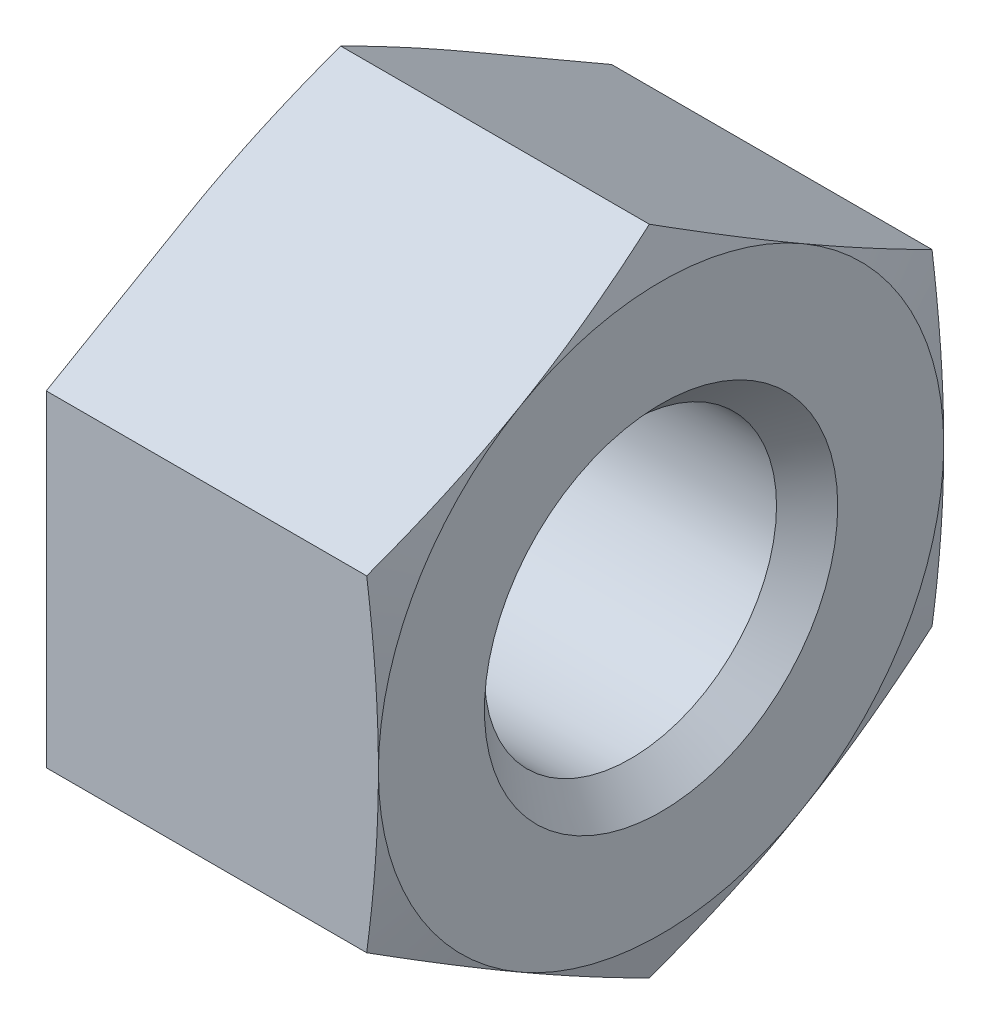
ISO-10303-21;
HEADER;
FILE_DESCRIPTION(('STEP AP214'),'2;1');
FILE_NAME('part.step','',(''),(''),'','','');
FILE_SCHEMA(('AUTOMOTIVE_DESIGN { 1 0 10303 214 1 1 1 1 }'));
ENDSEC;
DATA;
#1=APPLICATION_CONTEXT('core data for automotive mechanical design processes');
#2=APPLICATION_PROTOCOL_DEFINITION('international standard','automotive_design',2000,#1);
#3=PRODUCT_CONTEXT('',#1,'mechanical');
#4=PRODUCT('Part','Part','',(#3));
#5=PRODUCT_RELATED_PRODUCT_CATEGORY('part','',(#4));
#6=PRODUCT_DEFINITION_FORMATION('','',#4);
#7=PRODUCT_DEFINITION_CONTEXT('part definition',#1,'design');
#8=PRODUCT_DEFINITION('design','',#6,#7);
#9=PRODUCT_DEFINITION_SHAPE('','',#8);
#10=(LENGTH_UNIT() NAMED_UNIT(*) SI_UNIT(.MILLI.,.METRE.));
#11=(NAMED_UNIT(*) PLANE_ANGLE_UNIT() SI_UNIT($,.RADIAN.));
#12=(NAMED_UNIT(*) SI_UNIT($,.STERADIAN.) SOLID_ANGLE_UNIT());
#13=UNCERTAINTY_MEASURE_WITH_UNIT(LENGTH_MEASURE(1.E-05),#10,'distance_accuracy_value','');
#14=(GEOMETRIC_REPRESENTATION_CONTEXT(3) GLOBAL_UNCERTAINTY_ASSIGNED_CONTEXT((#13)) GLOBAL_UNIT_ASSIGNED_CONTEXT((#10,
#11,#12)) REPRESENTATION_CONTEXT('',''));
#15=CARTESIAN_POINT('',(0.,0.,0.));
#16=DIRECTION('',(0.,0.,1.));
#17=DIRECTION('',(1.,0.,0.));
#18=AXIS2_PLACEMENT_3D('',#15,#16,#17);
#19=CARTESIAN_POINT('',(4.70000000000001,0.,3.25));
#20=DIRECTION('',(1.,0.,0.));
#21=DIRECTION('',(0.,0.,-1.));
#22=AXIS2_PLACEMENT_3D('',#19,#20,#21);
#23=PLANE('',#22);
#24=CARTESIAN_POINT('',(4.70000000000001,0.,0.));
#25=DIRECTION('',(1.,0.,0.));
#26=DIRECTION('',(0.,0.,-1.));
#27=AXIS2_PLACEMENT_3D('',#24,#25,#26);
#28=CIRCLE('',#27,2.50000000003422);
#29=CARTESIAN_POINT('',(4.70000000000001,0.,-2.50000000003422));
#30=VERTEX_POINT('',#29);
#31=EDGE_CURVE('E13',#30,#30,#28,.F.);
#32=ORIENTED_EDGE('',*,*,#31,.T.);
#33=EDGE_LOOP('',(#32));
#34=FACE_BOUND('',#33,.T.);
#35=CARTESIAN_POINT('',(4.69999999999999,0.,0.));
#36=DIRECTION('',(-1.,0.,0.));
#37=DIRECTION('',(0.,0.,1.));
#38=AXIS2_PLACEMENT_3D('',#35,#36,#37);
#39=CIRCLE('',#38,3.99999999999999);
#40=CARTESIAN_POINT('',(4.69999999999999,3.46410161513776,1.99999999999999));
#41=VERTEX_POINT('',#40);
#42=CARTESIAN_POINT('',(4.69999999999999,3.46410161513776,-1.99999999999999));
#43=VERTEX_POINT('',#42);
#44=EDGE_CURVE('E294',#41,#43,#39,.T.);
#45=ORIENTED_EDGE('',*,*,#44,.F.);
#46=CARTESIAN_POINT('',(4.69999999999999,0.,0.));
#47=DIRECTION('',(-1.,0.,0.));
#48=DIRECTION('',(0.,0.,1.));
#49=AXIS2_PLACEMENT_3D('',#46,#47,#48);
#50=CIRCLE('',#49,3.99999999999999);
#51=CARTESIAN_POINT('',(4.69999999999999,0.,4.));
#52=VERTEX_POINT('',#51);
#53=EDGE_CURVE('E300',#52,#41,#50,.T.);
#54=ORIENTED_EDGE('',*,*,#53,.F.);
#55=CARTESIAN_POINT('',(4.69999999999999,0.,0.));
#56=DIRECTION('',(-1.,0.,0.));
#57=DIRECTION('',(0.,0.,1.));
#58=AXIS2_PLACEMENT_3D('',#55,#56,#57);
#59=CIRCLE('',#58,4.);
#60=CARTESIAN_POINT('',(4.69999999999999,-3.46410161513775,2.));
#61=VERTEX_POINT('',#60);
#62=EDGE_CURVE('E449',#61,#52,#59,.T.);
#63=ORIENTED_EDGE('',*,*,#62,.F.);
#64=CARTESIAN_POINT('',(4.69999999999999,0.,0.));
#65=DIRECTION('',(-1.,0.,0.));
#66=DIRECTION('',(0.,0.,1.));
#67=AXIS2_PLACEMENT_3D('',#64,#65,#66);
#68=CIRCLE('',#67,4.);
#69=CARTESIAN_POINT('',(4.69999999999999,-3.46410161513776,-2.));
#70=VERTEX_POINT('',#69);
#71=EDGE_CURVE('E351',#70,#61,#68,.T.);
#72=ORIENTED_EDGE('',*,*,#71,.F.);
#73=CARTESIAN_POINT('',(4.69999999999999,0.,0.));
#74=DIRECTION('',(-1.,0.,0.));
#75=DIRECTION('',(0.,0.,1.));
#76=AXIS2_PLACEMENT_3D('',#73,#74,#75);
#77=CIRCLE('',#76,3.99999999999999);
#78=CARTESIAN_POINT('',(4.69999999999999,0.,-4.));
#79=VERTEX_POINT('',#78);
#80=EDGE_CURVE('E453',#79,#70,#77,.T.);
#81=ORIENTED_EDGE('',*,*,#80,.F.);
#82=CARTESIAN_POINT('',(4.69999999999999,0.,0.));
#83=DIRECTION('',(-1.,0.,0.));
#84=DIRECTION('',(0.,0.,1.));
#85=AXIS2_PLACEMENT_3D('',#82,#83,#84);
#86=CIRCLE('',#85,3.99999999999999);
#87=EDGE_CURVE('E299',#43,#79,#86,.T.);
#88=ORIENTED_EDGE('',*,*,#87,.F.);
#89=EDGE_LOOP('',(#45,#54,#63,#72,#81,#88));
#90=FACE_BOUND('',#89,.T.);
#91=ADVANCED_FACE('F44',(#34,#90),#23,.T.);
#92=CARTESIAN_POINT('',(4.53319761746661,0.,0.));
#93=DIRECTION('',(-1.,0.,0.));
#94=DIRECTION('',(0.,0.,1.));
#95=AXIS2_PLACEMENT_3D('',#92,#93,#94);
#96=CONICAL_SURFACE('',#95,4.62251496643811,1.30899693899575);
#97=CARTESIAN_POINT('',(4.53419246269047,2.30940107675851,4.));
#98=CARTESIAN_POINT('',(4.55985048781709,2.11795151865036,4.));
#99=CARTESIAN_POINT('',(4.58314922202024,1.92615832316376,4.));
#100=CARTESIAN_POINT('',(4.62406480463608,1.54219210579289,4.));
#101=CARTESIAN_POINT('',(4.6416880879015,1.35001976439242,4.));
#102=CARTESIAN_POINT('',(4.67035550014955,0.965121254191912,4.));
#103=CARTESIAN_POINT('',(4.68139807691226,0.772394965493235,4.));
#104=CARTESIAN_POINT('',(4.69251903254672,0.482994576672206,4.));
#105=CARTESIAN_POINT('',(4.69531890816352,0.386419587345948,4.));
#106=CARTESIAN_POINT('',(4.69906161862543,0.193230639770234,4.));
#107=CARTESIAN_POINT('',(4.70000439372039,0.0966166803669827,4.));
#108=CARTESIAN_POINT('',(4.69999999999999,0.,4.));
#109=B_SPLINE_CURVE_WITH_KNOTS('',3,(#97,#98,#99,#100,#101,#102,#103,#104,#105,#106,#107,#108),
.UNSPECIFIED.,.F.,.F.,(4,2,2,2,2,4),(0.,0.579508867445603,1.15835835267688,1.73734431967293,
2.02717528177891,2.31701556872231),.UNSPECIFIED.);
#110=CARTESIAN_POINT('',(4.53419246269047,2.30940107675851,4.));
#111=VERTEX_POINT('',#110);
#112=EDGE_CURVE('E343',#111,#52,#109,.T.);
#113=ORIENTED_EDGE('',*,*,#112,.T.);
#114=ORIENTED_EDGE('',*,*,#53,.T.);
#115=CARTESIAN_POINT('',(4.69999999999999,3.46410161513776,1.99999999999999));
#116=CARTESIAN_POINT('',(4.70000439372039,3.41579327495427,2.08367249962712));
#117=CARTESIAN_POINT('',(4.69906161862543,3.36748629525264,2.16734264283053));
#118=CARTESIAN_POINT('',(4.69531890816352,3.27089182146479,2.33464917916148));
#119=CARTESIAN_POINT('',(4.69251903254672,3.22260432680166,2.41828557328823));
#120=CARTESIAN_POINT('',(4.68139807691226,3.07790413239114,2.66891366187234));
#121=CARTESIAN_POINT('',(4.67035550014955,2.98154098804181,2.83581952386249));
#122=CARTESIAN_POINT('',(4.6416880879015,2.78909173294155,3.16915141157491));
#123=CARTESIAN_POINT('',(4.62406480463608,2.69300556224132,3.33557754113246));
#124=CARTESIAN_POINT('',(4.58314922202024,2.50102245355589,3.66810203957064));
#125=CARTESIAN_POINT('',(4.55985048781709,2.40512585581259,3.83419981913503));
#126=CARTESIAN_POINT('',(4.53419246269047,2.30940107675851,4.));
#127=B_SPLINE_CURVE_WITH_KNOTS('',3,(#115,#116,#117,#118,#119,#120,#121,#122,#123,#124,#125,
#126),.UNSPECIFIED.,.F.,.F.,(4,2,2,2,2,4),(0.,0.2898402869434,0.579671249049377,
1.15865721604543,1.7375067012767,2.31701556872231),.UNSPECIFIED.);
#128=EDGE_CURVE('E270',#41,#111,#127,.T.);
#129=ORIENTED_EDGE('',*,*,#128,.T.);
#130=EDGE_LOOP('',(#113,#114,#129));
#131=FACE_BOUND('',#130,.T.);
#132=ADVANCED_FACE('F255',(#131),#96,.T.);
#133=CARTESIAN_POINT('',(4.53319761746661,0.,0.));
#134=DIRECTION('',(-1.,0.,0.));
#135=DIRECTION('',(0.,0.,1.));
#136=AXIS2_PLACEMENT_3D('',#133,#134,#135);
#137=CONICAL_SURFACE('',#136,4.6225149664381,1.30899693899575);
#138=CARTESIAN_POINT('',(4.53419246269047,4.618802153517,0.));
#139=CARTESIAN_POINT('',(4.5598504878171,4.52307737446293,0.165800180864965));
#140=CARTESIAN_POINT('',(4.58314922202024,4.42718077671963,0.331897960429355));
#141=CARTESIAN_POINT('',(4.62406480463608,4.2351976680342,0.664422458867538));
#142=CARTESIAN_POINT('',(4.6416880879015,4.13911149733396,0.830848588425083));
#143=CARTESIAN_POINT('',(4.67035550014955,3.94666224223371,1.1641804761375));
#144=CARTESIAN_POINT('',(4.68139807691226,3.85029909788437,1.33108633812765));
#145=CARTESIAN_POINT('',(4.69251903254672,3.70559890347386,1.58171442671175));
#146=CARTESIAN_POINT('',(4.69531890816352,3.65731140881073,1.6653508208385));
#147=CARTESIAN_POINT('',(4.69906161862543,3.56071693502288,1.83265735716945));
#148=CARTESIAN_POINT('',(4.70000439372039,3.51240995532125,1.91632750037286));
#149=CARTESIAN_POINT('',(4.69999999999999,3.46410161513776,1.99999999999999));
#150=B_SPLINE_CURVE_WITH_KNOTS('',3,(#138,#139,#140,#141,#142,#143,#144,#145,#146,#147,#148,
#149),.UNSPECIFIED.,.F.,.F.,(4,2,2,2,2,4),(0.,0.579508867445597,1.15835835267687,
1.73734431967291,2.02717528177889,2.31701556872228),.UNSPECIFIED.);
#151=CARTESIAN_POINT('',(4.53419246269047,4.618802153517,0.));
#152=VERTEX_POINT('',#151);
#153=EDGE_CURVE('E262',#152,#41,#150,.T.);
#154=ORIENTED_EDGE('',*,*,#153,.T.);
#155=ORIENTED_EDGE('',*,*,#44,.T.);
#156=CARTESIAN_POINT('',(4.69999999999999,3.46410161513776,-1.99999999999999));
#157=CARTESIAN_POINT('',(4.70000439372039,3.51240995532125,-1.91632750037286));
#158=CARTESIAN_POINT('',(4.69906161862543,3.56071693502288,-1.83265735716945));
#159=CARTESIAN_POINT('',(4.69531890816352,3.65731140881073,-1.6653508208385));
#160=CARTESIAN_POINT('',(4.69251903254672,3.70559890347386,-1.58171442671175));
#161=CARTESIAN_POINT('',(4.68139807691226,3.85029909788437,-1.33108633812765));
#162=CARTESIAN_POINT('',(4.67035550014955,3.94666224223371,-1.1641804761375));
#163=CARTESIAN_POINT('',(4.6416880879015,4.13911149733396,-0.830848588425084));
#164=CARTESIAN_POINT('',(4.62406480463608,4.2351976680342,-0.664422458867538));
#165=CARTESIAN_POINT('',(4.58314922202024,4.42718077671962,-0.331897960429356));
#166=CARTESIAN_POINT('',(4.5598504878171,4.52307737446292,-0.165800180864965));
#167=CARTESIAN_POINT('',(4.53419246269047,4.618802153517,0.));
#168=B_SPLINE_CURVE_WITH_KNOTS('',3,(#156,#157,#158,#159,#160,#161,#162,#163,#164,#165,#166,
#167),.UNSPECIFIED.,.F.,.F.,(4,2,2,2,2,4),(0.,0.289840286943397,0.57967124904937,
1.15865721604542,1.73750670127669,2.31701556872228),.UNSPECIFIED.);
#169=EDGE_CURVE('E233',#43,#152,#168,.T.);
#170=ORIENTED_EDGE('',*,*,#169,.T.);
#171=EDGE_LOOP('',(#154,#155,#170));
#172=FACE_BOUND('',#171,.T.);
#173=ADVANCED_FACE('F250',(#172),#137,.T.);
#174=CARTESIAN_POINT('',(4.53319761746661,0.,0.));
#175=DIRECTION('',(-1.,0.,0.));
#176=DIRECTION('',(0.,0.,1.));
#177=AXIS2_PLACEMENT_3D('',#174,#175,#176);
#178=CONICAL_SURFACE('',#177,4.62251496643811,1.30899693899575);
#179=ORIENTED_EDGE('',*,*,#87,.T.);
#180=CARTESIAN_POINT('',(4.69999999999999,0.,-4.));
#181=CARTESIAN_POINT('',(4.70000439372039,0.0966166803669833,-4.));
#182=CARTESIAN_POINT('',(4.69906161862543,0.193230639770234,-4.));
#183=CARTESIAN_POINT('',(4.69531890816352,0.386419587345948,-4.));
#184=CARTESIAN_POINT('',(4.69251903254672,0.482994576672206,-4.));
#185=CARTESIAN_POINT('',(4.68139807691226,0.772394965493235,-4.));
#186=CARTESIAN_POINT('',(4.67035550014955,0.965121254191912,-4.));
#187=CARTESIAN_POINT('',(4.6416880879015,1.35001976439242,-4.));
#188=CARTESIAN_POINT('',(4.62406480463608,1.54219210579289,-4.));
#189=CARTESIAN_POINT('',(4.58314922202024,1.92615832316376,-4.));
#190=CARTESIAN_POINT('',(4.55985048781709,2.11795151865036,-4.));
#191=CARTESIAN_POINT('',(4.53419246269047,2.30940107675851,-4.));
#192=B_SPLINE_CURVE_WITH_KNOTS('',3,(#180,#181,#182,#183,#184,#185,#186,#187,#188,#189,#190,
#191),.UNSPECIFIED.,.F.,.F.,(4,2,2,2,2,4),(0.,0.2898402869434,0.579671249049376,
1.15865721604543,1.7375067012767,2.31701556872231),.UNSPECIFIED.);
#193=CARTESIAN_POINT('',(4.53419246269047,2.30940107675851,-4.));
#194=VERTEX_POINT('',#193);
#195=EDGE_CURVE('E423',#79,#194,#192,.T.);
#196=ORIENTED_EDGE('',*,*,#195,.T.);
#197=CARTESIAN_POINT('',(4.53419246269047,2.30940107675851,-4.));
#198=CARTESIAN_POINT('',(4.55985048781709,2.40512585581259,-3.83419981913503));
#199=CARTESIAN_POINT('',(4.58314922202024,2.50102245355589,-3.66810203957064));
#200=CARTESIAN_POINT('',(4.62406480463608,2.69300556224132,-3.33557754113246));
#201=CARTESIAN_POINT('',(4.6416880879015,2.78909173294155,-3.16915141157491));
#202=CARTESIAN_POINT('',(4.67035550014955,2.98154098804181,-2.83581952386249));
#203=CARTESIAN_POINT('',(4.68139807691226,3.07790413239114,-2.66891366187234));
#204=CARTESIAN_POINT('',(4.69251903254672,3.22260432680166,-2.41828557328823));
#205=CARTESIAN_POINT('',(4.69531890816352,3.27089182146479,-2.33464917916148));
#206=CARTESIAN_POINT('',(4.69906161862543,3.36748629525264,-2.16734264283053));
#207=CARTESIAN_POINT('',(4.70000439372039,3.41579327495427,-2.08367249962712));
#208=CARTESIAN_POINT('',(4.69999999999999,3.46410161513776,-1.99999999999999));
#209=B_SPLINE_CURVE_WITH_KNOTS('',3,(#197,#198,#199,#200,#201,#202,#203,#204,#205,#206,#207,
#208),.UNSPECIFIED.,.F.,.F.,(4,2,2,2,2,4),(0.,0.579508867445603,1.15835835267688,
1.73734431967293,2.02717528177891,2.31701556872231),.UNSPECIFIED.);
#210=EDGE_CURVE('E225',#194,#43,#209,.T.);
#211=ORIENTED_EDGE('',*,*,#210,.T.);
#212=EDGE_LOOP('',(#179,#196,#211));
#213=FACE_BOUND('',#212,.T.);
#214=ADVANCED_FACE('F254',(#213),#178,.T.);
#215=CARTESIAN_POINT('',(4.53319761746661,0.,0.));
#216=DIRECTION('',(-1.,0.,0.));
#217=DIRECTION('',(0.,0.,1.));
#218=AXIS2_PLACEMENT_3D('',#215,#216,#217);
#219=CONICAL_SURFACE('',#218,4.62251496643811,1.30899693899575);
#220=ORIENTED_EDGE('',*,*,#80,.T.);
#221=CARTESIAN_POINT('',(4.69999999999998,-3.46410161513776,-2.));
#222=CARTESIAN_POINT('',(4.70000439372039,-3.41579327495427,-2.08367249962713));
#223=CARTESIAN_POINT('',(4.69906161862543,-3.36748629525265,-2.16734264283054));
#224=CARTESIAN_POINT('',(4.69531890816352,-3.27089182146479,-2.33464917916149));
#225=CARTESIAN_POINT('',(4.69251903254672,-3.22260432680166,-2.41828557328824));
#226=CARTESIAN_POINT('',(4.68139807691226,-3.07790413239115,-2.66891366187235));
#227=CARTESIAN_POINT('',(4.67035550014955,-2.98154098804181,-2.83581952386249));
#228=CARTESIAN_POINT('',(4.6416880879015,-2.78909173294156,-3.16915141157491));
#229=CARTESIAN_POINT('',(4.62406480463607,-2.69300556224132,-3.33557754113246));
#230=CARTESIAN_POINT('',(4.58314922202024,-2.50102245355589,-3.66810203957064));
#231=CARTESIAN_POINT('',(4.55985048781709,-2.40512585581259,-3.83419981913504));
#232=CARTESIAN_POINT('',(4.53419246269047,-2.30940107675851,-4.));
#233=B_SPLINE_CURVE_WITH_KNOTS('',3,(#221,#222,#223,#224,#225,#226,#227,#228,#229,#230,#231,
#232),.UNSPECIFIED.,.F.,.F.,(4,2,2,2,2,4),(0.,0.289840286943399,0.579671249049374,
1.15865721604542,1.7375067012767,2.3170155687223),.UNSPECIFIED.);
#234=CARTESIAN_POINT('',(4.53419246269047,-2.30940107675851,-4.));
#235=VERTEX_POINT('',#234);
#236=EDGE_CURVE('E369',#70,#235,#233,.T.);
#237=ORIENTED_EDGE('',*,*,#236,.T.);
#238=CARTESIAN_POINT('',(4.53419246269047,-2.30940107675851,-4.));
#239=CARTESIAN_POINT('',(4.55985048781709,-2.11795151865036,-4.));
#240=CARTESIAN_POINT('',(4.58314922202024,-1.92615832316375,-4.));
#241=CARTESIAN_POINT('',(4.62406480463608,-1.54219210579289,-4.));
#242=CARTESIAN_POINT('',(4.6416880879015,-1.35001976439242,-4.));
#243=CARTESIAN_POINT('',(4.67035550014955,-0.965121254191912,-4.));
#244=CARTESIAN_POINT('',(4.68139807691226,-0.772394965493235,-4.));
#245=CARTESIAN_POINT('',(4.69251903254672,-0.482994576672206,-4.));
#246=CARTESIAN_POINT('',(4.69531890816352,-0.386419587345949,-4.));
#247=CARTESIAN_POINT('',(4.69906161862543,-0.193230639770234,-4.));
#248=CARTESIAN_POINT('',(4.70000439372039,-0.0966166803669837,-4.));
#249=CARTESIAN_POINT('',(4.69999999999999,0.,-4.));
#250=B_SPLINE_CURVE_WITH_KNOTS('',3,(#238,#239,#240,#241,#242,#243,#244,#245,#246,#247,#248,
#249),.UNSPECIFIED.,.F.,.F.,(4,2,2,2,2,4),(0.,0.579508867445602,1.15835835267688,
1.73734431967293,2.02717528177891,2.31701556872231),.UNSPECIFIED.);
#251=EDGE_CURVE('E242',#235,#79,#250,.T.);
#252=ORIENTED_EDGE('',*,*,#251,.T.);
#253=EDGE_LOOP('',(#220,#237,#252));
#254=FACE_BOUND('',#253,.T.);
#255=ADVANCED_FACE('F379',(#254),#219,.T.);
#256=CARTESIAN_POINT('',(4.53319761746661,0.,0.));
#257=DIRECTION('',(-1.,0.,0.));
#258=DIRECTION('',(0.,0.,1.));
#259=AXIS2_PLACEMENT_3D('',#256,#257,#258);
#260=CONICAL_SURFACE('',#259,4.62251496643811,1.30899693899575);
#261=CARTESIAN_POINT('',(4.53419246269047,-2.30940107675851,3.99999999999999));
#262=CARTESIAN_POINT('',(4.55985048781709,-2.40512585581258,3.83419981913503));
#263=CARTESIAN_POINT('',(4.58314922202024,-2.50102245355588,3.66810203957064));
#264=CARTESIAN_POINT('',(4.62406480463608,-2.69300556224131,3.33557754113246));
#265=CARTESIAN_POINT('',(4.6416880879015,-2.78909173294155,3.16915141157491));
#266=CARTESIAN_POINT('',(4.67035550014955,-2.9815409880418,2.83581952386249));
#267=CARTESIAN_POINT('',(4.68139807691226,-3.07790413239114,2.66891366187234));
#268=CARTESIAN_POINT('',(4.69251903254672,-3.22260432680165,2.41828557328824));
#269=CARTESIAN_POINT('',(4.69531890816352,-3.27089182146478,2.33464917916149));
#270=CARTESIAN_POINT('',(4.69906161862543,-3.36748629525264,2.16734264283054));
#271=CARTESIAN_POINT('',(4.70000439372039,-3.41579327495427,2.08367249962713));
#272=CARTESIAN_POINT('',(4.69999999999999,-3.46410161513776,2.));
#273=B_SPLINE_CURVE_WITH_KNOTS('',3,(#261,#262,#263,#264,#265,#266,#267,#268,#269,#270,#271,
#272),.UNSPECIFIED.,.F.,.F.,(4,2,2,2,2,4),(0.,0.579508867445601,1.15835835267688,
1.73734431967292,2.0271752817789,2.3170155687223),.UNSPECIFIED.);
#274=CARTESIAN_POINT('',(4.53419246269047,-2.3094010767585,4.));
#275=VERTEX_POINT('',#274);
#276=EDGE_CURVE('E321',#275,#61,#273,.T.);
#277=ORIENTED_EDGE('',*,*,#276,.T.);
#278=ORIENTED_EDGE('',*,*,#62,.T.);
#279=CARTESIAN_POINT('',(4.69999999999999,0.,4.));
#280=CARTESIAN_POINT('',(4.70000439372039,-0.0966166803669837,4.));
#281=CARTESIAN_POINT('',(4.69906161862543,-0.193230639770234,4.));
#282=CARTESIAN_POINT('',(4.69531890816352,-0.386419587345948,4.));
#283=CARTESIAN_POINT('',(4.69251903254672,-0.482994576672206,4.));
#284=CARTESIAN_POINT('',(4.68139807691226,-0.772394965493235,4.));
#285=CARTESIAN_POINT('',(4.67035550014955,-0.965121254191912,4.));
#286=CARTESIAN_POINT('',(4.6416880879015,-1.35001976439242,4.));
#287=CARTESIAN_POINT('',(4.62406480463608,-1.54219210579289,4.));
#288=CARTESIAN_POINT('',(4.58314922202024,-1.92615832316375,4.));
#289=CARTESIAN_POINT('',(4.55985048781709,-2.11795151865035,4.));
#290=CARTESIAN_POINT('',(4.53419246269047,-2.30940107675851,4.));
#291=B_SPLINE_CURVE_WITH_KNOTS('',3,(#279,#280,#281,#282,#283,#284,#285,#286,#287,#288,#289,
#290),.UNSPECIFIED.,.F.,.F.,(4,2,2,2,2,4),(0.,0.289840286943399,0.579671249049375,
1.15865721604543,1.7375067012767,2.3170155687223),.UNSPECIFIED.);
#292=EDGE_CURVE('E271',#52,#275,#291,.T.);
#293=ORIENTED_EDGE('',*,*,#292,.T.);
#294=EDGE_LOOP('',(#277,#278,#293));
#295=FACE_BOUND('',#294,.T.);
#296=ADVANCED_FACE('F376',(#295),#260,.T.);
#297=CARTESIAN_POINT('',(4.53319761746661,0.,0.));
#298=DIRECTION('',(-1.,0.,0.));
#299=DIRECTION('',(0.,0.,1.));
#300=AXIS2_PLACEMENT_3D('',#297,#298,#299);
#301=CONICAL_SURFACE('',#300,4.62251496643811,1.30899693899575);
#302=ORIENTED_EDGE('',*,*,#71,.T.);
#303=CARTESIAN_POINT('',(4.69999999999999,-3.46410161513776,2.));
#304=CARTESIAN_POINT('',(4.70000439372039,-3.51240995532125,1.91632750037287));
#305=CARTESIAN_POINT('',(4.69906161862543,-3.56071693502287,1.83265735716946));
#306=CARTESIAN_POINT('',(4.69531890816352,-3.65731140881073,1.66535082083851));
#307=CARTESIAN_POINT('',(4.69251903254672,-3.70559890347386,1.58171442671176));
#308=CARTESIAN_POINT('',(4.68139807691226,-3.85029909788437,1.33108633812765));
#309=CARTESIAN_POINT('',(4.67035550014955,-3.94666224223371,1.16418047613751));
#310=CARTESIAN_POINT('',(4.6416880879015,-4.13911149733397,0.830848588425085));
#311=CARTESIAN_POINT('',(4.62406480463608,-4.2351976680342,0.664422458867538));
#312=CARTESIAN_POINT('',(4.58314922202024,-4.42718077671964,0.331897960429354));
#313=CARTESIAN_POINT('',(4.55985048781709,-4.52307737446294,0.165800180864962));
#314=CARTESIAN_POINT('',(4.53419246269047,-4.61880215351701,0.));
#315=B_SPLINE_CURVE_WITH_KNOTS('',3,(#303,#304,#305,#306,#307,#308,#309,#310,#311,#312,#313,
#314),.UNSPECIFIED.,.F.,.F.,(4,2,2,2,2,4),(0.,0.289840286943399,0.579671249049375,
1.15865721604542,1.7375067012767,2.3170155687223),.UNSPECIFIED.);
#316=CARTESIAN_POINT('',(4.53419246269046,-4.61880215351701,0.));
#317=VERTEX_POINT('',#316);
#318=EDGE_CURVE('E144',#61,#317,#315,.T.);
#319=ORIENTED_EDGE('',*,*,#318,.T.);
#320=CARTESIAN_POINT('',(4.53419246269046,-4.61880215351702,0.));
#321=CARTESIAN_POINT('',(4.55985048781709,-4.52307737446294,-0.165800180864969));
#322=CARTESIAN_POINT('',(4.58314922202024,-4.42718077671964,-0.33189796042936));
#323=CARTESIAN_POINT('',(4.62406480463607,-4.23519766803421,-0.664422458867544));
#324=CARTESIAN_POINT('',(4.6416880879015,-4.13911149733397,-0.83084858842509));
#325=CARTESIAN_POINT('',(4.67035550014955,-3.94666224223372,-1.16418047613751));
#326=CARTESIAN_POINT('',(4.68139807691226,-3.85029909788438,-1.33108633812766));
#327=CARTESIAN_POINT('',(4.69251903254671,-3.70559890347387,-1.58171442671176));
#328=CARTESIAN_POINT('',(4.69531890816352,-3.65731140881074,-1.66535082083851));
#329=CARTESIAN_POINT('',(4.69906161862543,-3.56071693502288,-1.83265735716946));
#330=CARTESIAN_POINT('',(4.70000439372039,-3.51240995532125,-1.91632750037287));
#331=CARTESIAN_POINT('',(4.69999999999998,-3.46410161513776,-2.));
#332=B_SPLINE_CURVE_WITH_KNOTS('',3,(#320,#321,#322,#323,#324,#325,#326,#327,#328,#329,#330,
#331),.UNSPECIFIED.,.F.,.F.,(4,2,2,2,2,4),(0.,0.579508867445601,1.15835835267688,
1.73734431967292,2.0271752817789,2.3170155687223),.UNSPECIFIED.);
#333=EDGE_CURVE('E140',#317,#70,#332,.T.);
#334=ORIENTED_EDGE('',*,*,#333,.T.);
#335=EDGE_LOOP('',(#302,#319,#334));
#336=FACE_BOUND('',#335,.T.);
#337=ADVANCED_FACE('F339',(#336),#301,.T.);
#338=CARTESIAN_POINT('',(5.7,-2.30940107675851,4.));
#339=DIRECTION('',(0.,0.,-1.));
#340=DIRECTION('',(0.,1.,0.));
#341=AXIS2_PLACEMENT_3D('',#338,#339,#340);
#342=PLANE('',#341);
#343=DIRECTION('',(1.,0.,0.));
#344=VECTOR('',#343,1.);
#345=CARTESIAN_POINT('',(5.7,-2.3094010767585,4.));
#346=LINE('',#345,#344);
#347=CARTESIAN_POINT('',(0.,-2.3094010767585,4.));
#348=VERTEX_POINT('',#347);
#349=EDGE_CURVE('E67',#348,#275,#346,.T.);
#350=ORIENTED_EDGE('',*,*,#349,.T.);
#351=ORIENTED_EDGE('',*,*,#292,.F.);
#352=ORIENTED_EDGE('',*,*,#112,.F.);
#353=DIRECTION('',(1.,0.,0.));
#354=VECTOR('',#353,1.);
#355=CARTESIAN_POINT('',(5.7,2.30940107675851,4.));
#356=LINE('',#355,#354);
#357=CARTESIAN_POINT('',(0.,2.30940107675851,4.));
#358=VERTEX_POINT('',#357);
#359=EDGE_CURVE('E59',#111,#358,#356,.F.);
#360=ORIENTED_EDGE('',*,*,#359,.T.);
#361=DIRECTION('',(0.,-1.,0.));
#362=VECTOR('',#361,1.);
#363=CARTESIAN_POINT('',(0.,0.,4.));
#364=LINE('',#363,#362);
#365=EDGE_CURVE('E475',#358,#348,#364,.T.);
#366=ORIENTED_EDGE('',*,*,#365,.T.);
#367=EDGE_LOOP('',(#350,#351,#352,#360,#366));
#368=FACE_BOUND('',#367,.T.);
#369=ADVANCED_FACE('F335',(#368),#342,.F.);
#370=CARTESIAN_POINT('',(5.7,2.30940107675851,4.));
#371=DIRECTION('',(0.,-0.86602540378444,-0.499999999999998));
#372=DIRECTION('',(0.,0.499999999999998,-0.86602540378444));
#373=AXIS2_PLACEMENT_3D('',#370,#371,#372);
#374=PLANE('',#373);
#375=CARTESIAN_POINT('',(0.,3.46410161513776,1.99999999999999));
#376=CARTESIAN_POINT('',(-4.39372070083307E-06,3.51240995619201,1.91632749886466));
#377=CARTESIAN_POINT('',(0.000938381408415104,3.56071693676432,1.83265735415317));
#378=CARTESIAN_POINT('',(0.00468109200491785,3.65731141229245,1.66535081480799));
#379=CARTESIAN_POINT('',(0.00748096772214884,3.70559890782517,1.58171441917507));
#380=CARTESIAN_POINT('',(0.0186019237527957,3.85029910483676,1.33108632608576));
#381=CARTESIAN_POINT('',(0.0296445009061809,3.94666225091496,1.16418046110114));
#382=CARTESIAN_POINT('',(0.0583119141422953,4.13911150945879,0.830848567424257));
#383=CARTESIAN_POINT('',(0.0759351980049652,4.23519768187376,0.664422434896714));
#384=CARTESIAN_POINT('',(0.11685078196834,4.42718079398107,0.33189793053165));
#385=CARTESIAN_POINT('',(0.140149516922129,4.52307739343151,0.165800148010415));
#386=CARTESIAN_POINT('',(0.165807542847884,4.61880217418641,-3.58004758444415E-08));
#387=B_SPLINE_CURVE_WITH_KNOTS('',3,(#375,#376,#377,#378,#379,#380,#381,#382,#383,#384,#385,
#386),.UNSPECIFIED.,.F.,.F.,(4,2,2,2,2,4),(0.,0.28984029216744,0.579671259496615,
1.15865723690889,1.73750673254591,2.31701561042692),.UNSPECIFIED.);
#388=CARTESIAN_POINT('',(0.,3.46410161513776,1.99999999999999));
#389=VERTEX_POINT('',#388);
#390=CARTESIAN_POINT('',(0.165807530836403,4.61880212935896,-4.18429600858075E-08));
#391=VERTEX_POINT('',#390);
#392=EDGE_CURVE('E158',#389,#391,#387,.T.);
#393=ORIENTED_EDGE('',*,*,#392,.F.);
#394=DIRECTION('',(0.,-0.499999999999998,0.86602540378444));
#395=VECTOR('',#394,1.);
#396=CARTESIAN_POINT('',(0.,2.05681033398805,4.4375));
#397=LINE('',#396,#395);
#398=EDGE_CURVE('E409',#389,#358,#397,.T.);
#399=ORIENTED_EDGE('',*,*,#398,.T.);
#400=ORIENTED_EDGE('',*,*,#359,.F.);
#401=ORIENTED_EDGE('',*,*,#128,.F.);
#402=ORIENTED_EDGE('',*,*,#153,.F.);
#403=DIRECTION('',(1.,0.,0.));
#404=VECTOR('',#403,1.);
#405=CARTESIAN_POINT('',(5.7,4.618802153517,0.));
#406=LINE('',#405,#404);
#407=EDGE_CURVE('E241',#152,#391,#406,.F.);
#408=ORIENTED_EDGE('',*,*,#407,.T.);
#409=EDGE_LOOP('',(#393,#399,#400,#401,#402,#408));
#410=FACE_BOUND('',#409,.T.);
#411=ADVANCED_FACE('F217',(#410),#374,.F.);
#412=CARTESIAN_POINT('',(5.7,4.618802153517,0.));
#413=DIRECTION('',(0.,-0.86602540378444,0.499999999999998));
#414=DIRECTION('',(0.,-0.499999999999998,-0.86602540378444));
#415=AXIS2_PLACEMENT_3D('',#412,#413,#414);
#416=PLANE('',#415);
#417=CARTESIAN_POINT('',(0.165807524363275,4.61880210520091,-8.36859197275272E-08));
#418=CARTESIAN_POINT('',(0.140149501104668,4.52307733012264,-0.165800257664584));
#419=CARTESIAN_POINT('',(0.11685076865619,4.42718073636988,-0.331898030317163));
#420=CARTESIAN_POINT('',(0.0759351891903148,4.23519763568333,-0.664422514900879));
#421=CARTESIAN_POINT('',(0.0583119073209905,4.13911146899138,-0.830848637515864));
#422=CARTESIAN_POINT('',(0.0296444973825989,3.94666222194073,-1.16418051128598));
#423=CARTESIAN_POINT('',(0.018601921533124,3.85029908163271,-1.33108636627635));
#424=CARTESIAN_POINT('',(0.00748096682478807,3.7055988933024,-1.58171444432923));
#425=CARTESIAN_POINT('',(0.00468109144274874,3.65731140067199,-1.66535083493522));
#426=CARTESIAN_POINT('',(0.000938381295457127,3.56071693095213,-1.83265736422019));
#427=CARTESIAN_POINT('',(-4.39371966086529E-06,3.51240995328579,-1.91632750389839));
#428=CARTESIAN_POINT('',(0.,3.46410161513776,-1.99999999999999));
#429=B_SPLINE_CURVE_WITH_KNOTS('',3,(#417,#418,#419,#420,#421,#422,#423,#424,#425,#426,#427,
#428),.UNSPECIFIED.,.F.,.F.,(4,2,2,2,2,4),(0.,0.579508843052138,1.15835830395929,
1.73734424660674,2.02717519650315,2.31701547123501),.UNSPECIFIED.);
#430=CARTESIAN_POINT('',(0.,3.46410161513776,-1.99999999999999));
#431=VERTEX_POINT('',#430);
#432=EDGE_CURVE('E143',#391,#431,#429,.T.);
#433=ORIENTED_EDGE('',*,*,#432,.F.);
#434=ORIENTED_EDGE('',*,*,#407,.F.);
#435=ORIENTED_EDGE('',*,*,#169,.F.);
#436=ORIENTED_EDGE('',*,*,#210,.F.);
#437=DIRECTION('',(1.,0.,0.));
#438=VECTOR('',#437,1.);
#439=CARTESIAN_POINT('',(5.7,2.30940107675851,-4.));
#440=LINE('',#439,#438);
#441=CARTESIAN_POINT('',(0.,2.30940107675851,-4.));
#442=VERTEX_POINT('',#441);
#443=EDGE_CURVE('E420',#194,#442,#440,.F.);
#444=ORIENTED_EDGE('',*,*,#443,.T.);
#445=DIRECTION('',(0.,-0.499999999999998,-0.86602540378444));
#446=VECTOR('',#445,1.);
#447=CARTESIAN_POINT('',(0.,4.618802153517,0.));
#448=LINE('',#447,#446);
#449=EDGE_CURVE('E407',#431,#442,#448,.T.);
#450=ORIENTED_EDGE('',*,*,#449,.F.);
#451=EDGE_LOOP('',(#433,#434,#435,#436,#444,#450));
#452=FACE_BOUND('',#451,.T.);
#453=ADVANCED_FACE('F213',(#452),#416,.F.);
#454=CARTESIAN_POINT('',(5.7,2.30940107675851,-4.));
#455=DIRECTION('',(0.,0.,1.));
#456=DIRECTION('',(0.,-1.,0.));
#457=AXIS2_PLACEMENT_3D('',#454,#455,#456);
#458=PLANE('',#457);
#459=DIRECTION('',(0.,-1.,0.));
#460=VECTOR('',#459,1.);
#461=CARTESIAN_POINT('',(0.,2.30940107675851,-4.));
#462=LINE('',#461,#460);
#463=CARTESIAN_POINT('',(0.,-2.30940107675851,-4.));
#464=VERTEX_POINT('',#463);
#465=EDGE_CURVE('E470',#442,#464,#462,.T.);
#466=ORIENTED_EDGE('',*,*,#465,.F.);
#467=ORIENTED_EDGE('',*,*,#443,.F.);
#468=ORIENTED_EDGE('',*,*,#195,.F.);
#469=ORIENTED_EDGE('',*,*,#251,.F.);
#470=DIRECTION('',(1.,0.,0.));
#471=VECTOR('',#470,1.);
#472=CARTESIAN_POINT('',(5.7,-2.30940107675851,-4.));
#473=LINE('',#472,#471);
#474=EDGE_CURVE('E322',#235,#464,#473,.F.);
#475=ORIENTED_EDGE('',*,*,#474,.T.);
#476=EDGE_LOOP('',(#466,#467,#468,#469,#475));
#477=FACE_BOUND('',#476,.T.);
#478=ADVANCED_FACE('F216',(#477),#458,.F.);
#479=CARTESIAN_POINT('',(5.7,-2.30940107675851,-4.));
#480=DIRECTION('',(0.,0.866025403784438,0.500000000000001));
#481=DIRECTION('',(0.,-0.500000000000001,0.866025403784438));
#482=AXIS2_PLACEMENT_3D('',#479,#480,#481);
#483=PLANE('',#482);
#484=ORIENTED_EDGE('',*,*,#474,.F.);
#485=ORIENTED_EDGE('',*,*,#236,.F.);
#486=ORIENTED_EDGE('',*,*,#333,.F.);
#487=DIRECTION('',(1.,0.,0.));
#488=VECTOR('',#487,1.);
#489=CARTESIAN_POINT('',(5.7,-4.61880215351701,0.));
#490=LINE('',#489,#488);
#491=CARTESIAN_POINT('',(0.16580754037502,-4.61880216495756,-1.98156089690053E-08));
#492=VERTEX_POINT('',#491);
#493=EDGE_CURVE('E130',#317,#492,#490,.F.);
#494=ORIENTED_EDGE('',*,*,#493,.T.);
#495=CARTESIAN_POINT('',(0.,-3.46410161513776,-2.));
#496=CARTESIAN_POINT('',(-4.39371965883195E-06,-3.51240995328579,-1.9163275038984));
#497=CARTESIAN_POINT('',(0.000938381295459185,-3.56071693095213,-1.8326573642202));
#498=CARTESIAN_POINT('',(0.00468109144275101,-3.65731140067199,-1.66535083493523));
#499=CARTESIAN_POINT('',(0.00748096682479054,-3.70559889330241,-1.58171444432925));
#500=CARTESIAN_POINT('',(0.0186019215331267,-3.85029908163272,-1.33108636627637));
#501=CARTESIAN_POINT('',(0.0296444973826015,-3.94666222194073,-1.16418051128599));
#502=CARTESIAN_POINT('',(0.0583119073209926,-4.13911146899139,-0.830848637515885));
#503=CARTESIAN_POINT('',(0.0759351891903167,-4.23519763568334,-0.664422514900901));
#504=CARTESIAN_POINT('',(0.116850768656192,-4.42718073636988,-0.331898030317188));
#505=CARTESIAN_POINT('',(0.14014950110467,-4.52307733012265,-0.16580025766461));
#506=CARTESIAN_POINT('',(0.165807524363276,-4.61880210520092,-8.36859480108692E-08));
#507=B_SPLINE_CURVE_WITH_KNOTS('',3,(#495,#496,#497,#498,#499,#500,#501,#502,#503,#504,#505,
#506),.UNSPECIFIED.,.F.,.F.,(4,2,2,2,2,4),(0.,0.289840274731858,0.579671224628262,
1.15865716727571,1.73750662818286,2.31701547123499),.UNSPECIFIED.);
#508=CARTESIAN_POINT('',(0.,-3.46410161513776,-2.));
#509=VERTEX_POINT('',#508);
#510=EDGE_CURVE('E136',#509,#492,#507,.T.);
#511=ORIENTED_EDGE('',*,*,#510,.F.);
#512=DIRECTION('',(0.,0.500000000000001,-0.866025403784438));
#513=VECTOR('',#512,1.);
#514=CARTESIAN_POINT('',(0.,-4.87139289628748,0.437499999999989));
#515=LINE('',#514,#513);
#516=EDGE_CURVE('E414',#509,#464,#515,.T.);
#517=ORIENTED_EDGE('',*,*,#516,.T.);
#518=EDGE_LOOP('',(#484,#485,#486,#494,#511,#517));
#519=FACE_BOUND('',#518,.T.);
#520=ADVANCED_FACE('F133',(#519),#483,.F.);
#521=CARTESIAN_POINT('',(5.7,-4.61880215351701,0.));
#522=DIRECTION('',(0.,0.866025403784438,-0.500000000000001));
#523=DIRECTION('',(0.,0.500000000000001,0.866025403784438));
#524=AXIS2_PLACEMENT_3D('',#521,#522,#523);
#525=PLANE('',#524);
#526=ORIENTED_EDGE('',*,*,#493,.F.);
#527=ORIENTED_EDGE('',*,*,#318,.F.);
#528=ORIENTED_EDGE('',*,*,#276,.F.);
#529=ORIENTED_EDGE('',*,*,#349,.F.);
#530=DIRECTION('',(0.,0.500000000000001,0.866025403784438));
#531=VECTOR('',#530,1.);
#532=CARTESIAN_POINT('',(0.,-4.61880215351701,0.));
#533=LINE('',#532,#531);
#534=CARTESIAN_POINT('',(0.,-3.46410161513775,2.));
#535=VERTEX_POINT('',#534);
#536=EDGE_CURVE('E150',#535,#348,#533,.T.);
#537=ORIENTED_EDGE('',*,*,#536,.F.);
#538=CARTESIAN_POINT('',(0.165807576456816,-4.6188021379498,-5.67217183307526E-08));
#539=CARTESIAN_POINT('',(0.14014952920633,-4.5230773814591,0.165800138754355));
#540=CARTESIAN_POINT('',(0.116850785474568,-4.42718079177974,0.331897926322379));
#541=CARTESIAN_POINT('',(0.075935195029017,-4.23519768654201,0.664422434824051));
#542=CARTESIAN_POINT('',(0.0583119134449694,-4.1391115112403,0.830848566447609));
#543=CARTESIAN_POINT('',(0.0296445018105226,-3.94666225052154,1.16418045967308));
#544=CARTESIAN_POINT('',(0.0186019239704145,-3.85029910515634,1.33108632511004));
#545=CARTESIAN_POINT('',(0.00748096766269976,-3.70559890830924,1.58171441854798));
#546=CARTESIAN_POINT('',(0.00468109197882929,-3.65731141266128,1.66535081427484));
#547=CARTESIAN_POINT('',(0.000938381453466295,-3.5607169368851,1.83265735383831));
#548=CARTESIAN_POINT('',(-4.3936371987235E-06,-3.51240995617998,1.91632749867414));
#549=CARTESIAN_POINT('',(0.,-3.46410161513776,2.));
#550=B_SPLINE_CURVE_WITH_KNOTS('',3,(#538,#539,#540,#541,#542,#543,#544,#545,#546,#547,#548,
#549),.UNSPECIFIED.,.F.,.F.,(4,2,2,2,2,4),(0.,0.579508879501608,1.15835837628525,
1.7373443540473,2.02717532177881,2.31701561445339),.UNSPECIFIED.);
#551=EDGE_CURVE('E147',#492,#535,#550,.T.);
#552=ORIENTED_EDGE('',*,*,#551,.F.);
#553=EDGE_LOOP('',(#526,#527,#528,#529,#537,#552));
#554=FACE_BOUND('',#553,.T.);
#555=ADVANCED_FACE('F148',(#554),#525,.F.);
#556=CARTESIAN_POINT('',(0.166802382533387,0.,0.));
#557=DIRECTION('',(1.,0.,0.));
#558=DIRECTION('',(0.,0.,-1.));
#559=AXIS2_PLACEMENT_3D('',#556,#557,#558);
#560=CONICAL_SURFACE('',#559,4.6225149664381,1.30899693899575);
#561=CARTESIAN_POINT('',(0.,0.,0.));
#562=DIRECTION('',(1.,0.,0.));
#563=DIRECTION('',(0.,0.,-1.));
#564=AXIS2_PLACEMENT_3D('',#561,#562,#563);
#565=CIRCLE('',#564,4.);
#566=EDGE_CURVE('E154',#389,#431,#565,.F.);
#567=ORIENTED_EDGE('',*,*,#566,.F.);
#568=ORIENTED_EDGE('',*,*,#392,.T.);
#569=ORIENTED_EDGE('',*,*,#432,.T.);
#570=EDGE_LOOP('',(#567,#568,#569));
#571=FACE_BOUND('',#570,.T.);
#572=ADVANCED_FACE('F190',(#571),#560,.T.);
#573=CARTESIAN_POINT('',(0.16680238253339,0.,0.));
#574=DIRECTION('',(1.,0.,0.));
#575=DIRECTION('',(0.,0.,-1.));
#576=AXIS2_PLACEMENT_3D('',#573,#574,#575);
#577=CONICAL_SURFACE('',#576,4.62251496643811,1.30899693899575);
#578=ORIENTED_EDGE('',*,*,#551,.T.);
#579=CARTESIAN_POINT('',(0.,0.,0.));
#580=DIRECTION('',(1.,0.,0.));
#581=DIRECTION('',(0.,0.,-1.));
#582=AXIS2_PLACEMENT_3D('',#579,#580,#581);
#583=CIRCLE('',#582,4.);
#584=EDGE_CURVE('E156',#509,#535,#583,.F.);
#585=ORIENTED_EDGE('',*,*,#584,.F.);
#586=ORIENTED_EDGE('',*,*,#510,.T.);
#587=EDGE_LOOP('',(#578,#585,#586));
#588=FACE_BOUND('',#587,.T.);
#589=ADVANCED_FACE('F155',(#588),#577,.T.);
#590=CARTESIAN_POINT('',(0.,0.,3.25));
#591=DIRECTION('',(-1.,0.,0.));
#592=DIRECTION('',(0.,0.,1.));
#593=AXIS2_PLACEMENT_3D('',#590,#591,#592);
#594=PLANE('',#593);
#595=CARTESIAN_POINT('',(0.,0.,0.));
#596=DIRECTION('',(-1.,0.,0.));
#597=DIRECTION('',(0.,0.,1.));
#598=AXIS2_PLACEMENT_3D('',#595,#596,#597);
#599=CIRCLE('',#598,2.50000000003422);
#600=CARTESIAN_POINT('',(0.,0.,2.50000000003422));
#601=VERTEX_POINT('',#600);
#602=EDGE_CURVE('E402',#601,#601,#599,.F.);
#603=ORIENTED_EDGE('',*,*,#602,.T.);
#604=EDGE_LOOP('',(#603));
#605=FACE_BOUND('',#604,.T.);
#606=ORIENTED_EDGE('',*,*,#566,.T.);
#607=ORIENTED_EDGE('',*,*,#449,.T.);
#608=ORIENTED_EDGE('',*,*,#465,.T.);
#609=ORIENTED_EDGE('',*,*,#516,.F.);
#610=ORIENTED_EDGE('',*,*,#584,.T.);
#611=ORIENTED_EDGE('',*,*,#536,.T.);
#612=ORIENTED_EDGE('',*,*,#365,.F.);
#613=ORIENTED_EDGE('',*,*,#398,.F.);
#614=EDGE_LOOP('',(#606,#607,#608,#609,#610,#611,#612,#613));
#615=FACE_BOUND('',#614,.T.);
#616=ADVANCED_FACE('F189',(#605,#615),#594,.T.);
#617=CARTESIAN_POINT('',(4.70000000000001,0.,0.));
#618=DIRECTION('',(1.,0.,0.));
#619=DIRECTION('',(0.,0.,-1.));
#620=AXIS2_PLACEMENT_3D('',#617,#618,#619);
#621=CYLINDRICAL_SURFACE('',#620,2.06699999999999);
#622=CARTESIAN_POINT('',(0.433000000034231,0.,0.));
#623=DIRECTION('',(-1.,0.,0.));
#624=DIRECTION('',(0.,0.,1.));
#625=AXIS2_PLACEMENT_3D('',#622,#623,#624);
#626=CIRCLE('',#625,2.06699999999999);
#627=CARTESIAN_POINT('',(0.433000000034232,0.,2.06699999999999));
#628=VERTEX_POINT('',#627);
#629=EDGE_CURVE('E52',#628,#628,#626,.T.);
#630=ORIENTED_EDGE('',*,*,#629,.T.);
#631=EDGE_LOOP('',(#630));
#632=FACE_BOUND('',#631,.T.);
#633=CARTESIAN_POINT('',(4.26699999996578,0.,0.));
#634=DIRECTION('',(1.,0.,0.));
#635=DIRECTION('',(0.,0.,-1.));
#636=AXIS2_PLACEMENT_3D('',#633,#634,#635);
#637=CIRCLE('',#636,2.06699999999999);
#638=CARTESIAN_POINT('',(4.26699999996578,0.,-2.06699999999999));
#639=VERTEX_POINT('',#638);
#640=EDGE_CURVE('E479',#639,#639,#637,.T.);
#641=ORIENTED_EDGE('',*,*,#640,.T.);
#642=EDGE_LOOP('',(#641));
#643=FACE_BOUND('',#642,.T.);
#644=ADVANCED_FACE('F392',(#632,#643),#621,.F.);
#645=CARTESIAN_POINT('',(0.,0.,0.));
#646=DIRECTION('',(-1.,0.,0.));
#647=DIRECTION('',(0.,0.,1.));
#648=AXIS2_PLACEMENT_3D('',#645,#646,#647);
#649=CONICAL_SURFACE('',#648,2.50000000003422,0.785398163397447);
#650=ORIENTED_EDGE('',*,*,#629,.F.);
#651=EDGE_LOOP('',(#650));
#652=FACE_BOUND('',#651,.T.);
#653=ORIENTED_EDGE('',*,*,#602,.F.);
#654=EDGE_LOOP('',(#653));
#655=FACE_BOUND('',#654,.T.);
#656=ADVANCED_FACE('F397',(#652,#655),#649,.F.);
#657=CARTESIAN_POINT('',(4.26699999996578,0.,0.));
#658=DIRECTION('',(1.,0.,0.));
#659=DIRECTION('',(0.,0.,-1.));
#660=AXIS2_PLACEMENT_3D('',#657,#658,#659);
#661=CONICAL_SURFACE('',#660,2.06699999999999,0.785398163397452);
#662=ORIENTED_EDGE('',*,*,#31,.F.);
#663=EDGE_LOOP('',(#662));
#664=FACE_BOUND('',#663,.T.);
#665=ORIENTED_EDGE('',*,*,#640,.F.);
#666=EDGE_LOOP('',(#665));
#667=FACE_BOUND('',#666,.T.);
#668=ADVANCED_FACE('F46',(#664,#667),#661,.F.);
#669=CLOSED_SHELL('',(#91,#132,#173,#214,#255,#296,#337,#369,#411,#453,#478,#520,#555,#572,#589,
#616,#644,#656,#668));
#670=MANIFOLD_SOLID_BREP('B2',#669);
#671=ADVANCED_BREP_SHAPE_REPRESENTATION('',(#18,#670),#14);
#672=SHAPE_DEFINITION_REPRESENTATION(#9,#671);
ENDSEC;
END-ISO-10303-21;
